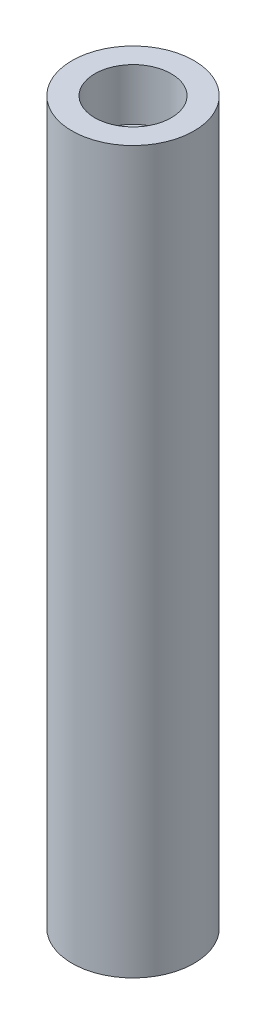
ISO-10303-21;
HEADER;
FILE_DESCRIPTION(('STEP AP214'),'2;1');
FILE_NAME('part.step','',(''),(''),'','','');
FILE_SCHEMA(('AUTOMOTIVE_DESIGN { 1 0 10303 214 1 1 1 1 }'));
ENDSEC;
DATA;
#1=APPLICATION_CONTEXT('core data for automotive mechanical design processes');
#2=APPLICATION_PROTOCOL_DEFINITION('international standard','automotive_design',2000,#1);
#3=PRODUCT_CONTEXT('',#1,'mechanical');
#4=PRODUCT('Part','Part','',(#3));
#5=PRODUCT_RELATED_PRODUCT_CATEGORY('part','',(#4));
#6=PRODUCT_DEFINITION_FORMATION('','',#4);
#7=PRODUCT_DEFINITION_CONTEXT('part definition',#1,'design');
#8=PRODUCT_DEFINITION('design','',#6,#7);
#9=PRODUCT_DEFINITION_SHAPE('','',#8);
#10=(LENGTH_UNIT() NAMED_UNIT(*) SI_UNIT(.MILLI.,.METRE.));
#11=(NAMED_UNIT(*) PLANE_ANGLE_UNIT() SI_UNIT($,.RADIAN.));
#12=(NAMED_UNIT(*) SI_UNIT($,.STERADIAN.) SOLID_ANGLE_UNIT());
#13=UNCERTAINTY_MEASURE_WITH_UNIT(LENGTH_MEASURE(1.E-05),#10,'distance_accuracy_value','');
#14=(GEOMETRIC_REPRESENTATION_CONTEXT(3) GLOBAL_UNCERTAINTY_ASSIGNED_CONTEXT((#13)) GLOBAL_UNIT_ASSIGNED_CONTEXT((#10,
#11,#12)) REPRESENTATION_CONTEXT('',''));
#15=CARTESIAN_POINT('',(0.,0.,0.));
#16=DIRECTION('',(0.,0.,1.));
#17=DIRECTION('',(1.,0.,0.));
#18=AXIS2_PLACEMENT_3D('',#15,#16,#17);
#19=CARTESIAN_POINT('',(0.,58.5,0.));
#20=DIRECTION('',(0.,-1.,0.));
#21=DIRECTION('',(0.,0.,-1.));
#22=AXIS2_PLACEMENT_3D('',#19,#20,#21);
#23=CYLINDRICAL_SURFACE('',#22,4.95);
#24=CARTESIAN_POINT('',(0.,58.5,0.));
#25=DIRECTION('',(0.,1.,0.));
#26=DIRECTION('',(0.,0.,1.));
#27=AXIS2_PLACEMENT_3D('',#24,#25,#26);
#28=CIRCLE('',#27,4.95);
#29=CARTESIAN_POINT('',(0.,58.5,-4.95));
#30=VERTEX_POINT('',#29);
#31=EDGE_CURVE('E10',#30,#30,#28,.T.);
#32=CARTESIAN_POINT('',(0.,0.,0.));
#33=DIRECTION('',(0.,1.,0.));
#34=DIRECTION('',(0.,0.,1.));
#35=AXIS2_PLACEMENT_3D('',#32,#33,#34);
#36=CIRCLE('',#35,4.95);
#37=CARTESIAN_POINT('',(0.,0.,-4.95));
#38=VERTEX_POINT('',#37);
#39=EDGE_CURVE('E40',#38,#38,#36,.T.);
#40=CARTESIAN_POINT('',(0.,58.5,-4.95));
#41=CARTESIAN_POINT('',(0.,57.890625,-4.95));
#42=CARTESIAN_POINT('',(0.,57.28125,-4.95));
#43=CARTESIAN_POINT('',(0.,56.0625,-4.95));
#44=CARTESIAN_POINT('',(0.,55.453125,-4.95));
#45=CARTESIAN_POINT('',(0.,54.234375,-4.95));
#46=CARTESIAN_POINT('',(0.,53.625,-4.95));
#47=CARTESIAN_POINT('',(0.,52.40625,-4.95));
#48=CARTESIAN_POINT('',(0.,51.796875,-4.95));
#49=CARTESIAN_POINT('',(0.,50.578125,-4.95));
#50=CARTESIAN_POINT('',(0.,49.96875,-4.95));
#51=CARTESIAN_POINT('',(0.,48.75,-4.95));
#52=CARTESIAN_POINT('',(0.,48.140625,-4.95));
#53=CARTESIAN_POINT('',(0.,46.921875,-4.95));
#54=CARTESIAN_POINT('',(0.,46.3125,-4.95));
#55=CARTESIAN_POINT('',(0.,45.09375,-4.95));
#56=CARTESIAN_POINT('',(0.,44.484375,-4.95));
#57=CARTESIAN_POINT('',(0.,43.265625,-4.95));
#58=CARTESIAN_POINT('',(0.,42.65625,-4.95));
#59=CARTESIAN_POINT('',(0.,41.4375,-4.95));
#60=CARTESIAN_POINT('',(0.,40.828125,-4.95));
#61=CARTESIAN_POINT('',(0.,39.609375,-4.95));
#62=CARTESIAN_POINT('',(0.,39.,-4.95));
#63=CARTESIAN_POINT('',(0.,37.78125,-4.95));
#64=CARTESIAN_POINT('',(0.,37.171875,-4.95));
#65=CARTESIAN_POINT('',(0.,35.953125,-4.95));
#66=CARTESIAN_POINT('',(0.,35.34375,-4.95));
#67=CARTESIAN_POINT('',(0.,34.125,-4.95));
#68=CARTESIAN_POINT('',(0.,33.515625,-4.95));
#69=CARTESIAN_POINT('',(0.,32.296875,-4.95));
#70=CARTESIAN_POINT('',(0.,31.6875,-4.95));
#71=CARTESIAN_POINT('',(0.,30.46875,-4.95));
#72=CARTESIAN_POINT('',(0.,29.859375,-4.95));
#73=CARTESIAN_POINT('',(0.,28.640625,-4.95));
#74=CARTESIAN_POINT('',(0.,28.03125,-4.95));
#75=CARTESIAN_POINT('',(0.,26.8125,-4.95));
#76=CARTESIAN_POINT('',(0.,26.203125,-4.95));
#77=CARTESIAN_POINT('',(0.,24.984375,-4.95));
#78=CARTESIAN_POINT('',(0.,24.375,-4.95));
#79=CARTESIAN_POINT('',(0.,23.15625,-4.95));
#80=CARTESIAN_POINT('',(0.,22.546875,-4.95));
#81=CARTESIAN_POINT('',(0.,21.328125,-4.95));
#82=CARTESIAN_POINT('',(0.,20.71875,-4.95));
#83=CARTESIAN_POINT('',(0.,19.5,-4.95));
#84=CARTESIAN_POINT('',(0.,18.890625,-4.95));
#85=CARTESIAN_POINT('',(0.,17.671875,-4.95));
#86=CARTESIAN_POINT('',(0.,17.0625,-4.95));
#87=CARTESIAN_POINT('',(0.,15.84375,-4.95));
#88=CARTESIAN_POINT('',(0.,15.234375,-4.95));
#89=CARTESIAN_POINT('',(0.,14.015625,-4.95));
#90=CARTESIAN_POINT('',(0.,13.40625,-4.95));
#91=CARTESIAN_POINT('',(0.,12.1875,-4.95));
#92=CARTESIAN_POINT('',(0.,11.578125,-4.95));
#93=CARTESIAN_POINT('',(0.,10.359375,-4.95));
#94=CARTESIAN_POINT('',(0.,9.74999999999999,-4.95));
#95=CARTESIAN_POINT('',(0.,8.53124999999999,-4.95));
#96=CARTESIAN_POINT('',(0.,7.92187499999999,-4.95));
#97=CARTESIAN_POINT('',(0.,6.70312499999999,-4.95));
#98=CARTESIAN_POINT('',(0.,6.09374999999999,-4.95));
#99=CARTESIAN_POINT('',(0.,4.87499999999999,-4.95));
#100=CARTESIAN_POINT('',(0.,4.26562499999999,-4.95));
#101=CARTESIAN_POINT('',(0.,3.04687499999999,-4.95));
#102=CARTESIAN_POINT('',(0.,2.43749999999999,-4.95));
#103=CARTESIAN_POINT('',(0.,1.21874999999999,-4.95));
#104=CARTESIAN_POINT('',(0.,0.609374999999993,-4.95));
#105=CARTESIAN_POINT('',(0.,0.,-4.95));
#106=B_SPLINE_CURVE_WITH_KNOTS('',3,(#40,#41,#42,#43,#44,#45,#46,#47,#48,#49,#50,#51,#52,#53,
#54,#55,#56,#57,#58,#59,#60,#61,#62,#63,#64,#65,#66,#67,#68,#69,#70,#71,#72,#73,#74,#75,#76,#77,
#78,#79,#80,#81,#82,#83,#84,#85,#86,#87,#88,#89,#90,#91,#92,#93,#94,#95,#96,#97,#98,#99,#100,
#101,#102,#103,#104,#105),.UNSPECIFIED.,.F.,.F.,(4,2,2,2,2,2,2,2,2,2,2,2,2,2,2,2,2,2,2,2,2,2,2,
2,2,2,2,2,2,2,2,2,4),(0.,1.82812500000001,3.65625000000001,5.48437500000001,7.31250000000001,
9.140625,10.96875,12.796875,14.625,16.453125,18.28125,20.109375,21.9375,23.765625,25.59375,
27.421875,29.25,31.078125,32.90625,34.734375,36.5625,38.390625,40.21875,42.046875,43.875,
45.703125,47.53125,49.359375,51.1875,53.015625,54.84375,56.671875,58.5),.UNSPECIFIED.);
#107=EDGE_CURVE('BSEAM37',#30,#38,#106,.T.);
#108=ORIENTED_EDGE('',*,*,#31,.F.);
#109=ORIENTED_EDGE('',*,*,#39,.T.);
#110=ORIENTED_EDGE('',*,*,#107,.T.);
#111=ORIENTED_EDGE('',*,*,#107,.F.);
#112=EDGE_LOOP('',(#108,#110,#109,#111));
#113=FACE_BOUND('',#112,.T.);
#114=ADVANCED_FACE('F37',(#113),#23,.T.);
#115=CARTESIAN_POINT('',(0.,58.5,0.));
#116=DIRECTION('',(0.,1.,0.));
#117=DIRECTION('',(0.,0.,1.));
#118=AXIS2_PLACEMENT_3D('',#115,#116,#117);
#119=PLANE('',#118);
#120=CARTESIAN_POINT('',(0.,58.5,0.));
#121=DIRECTION('',(0.,1.,0.));
#122=DIRECTION('',(0.,0.,1.));
#123=AXIS2_PLACEMENT_3D('',#120,#121,#122);
#124=CIRCLE('',#123,3.1);
#125=CARTESIAN_POINT('',(0.,58.5,3.1));
#126=VERTEX_POINT('',#125);
#127=EDGE_CURVE('E51',#126,#126,#124,.T.);
#128=ORIENTED_EDGE('',*,*,#127,.F.);
#129=EDGE_LOOP('',(#128));
#130=FACE_BOUND('',#129,.T.);
#131=ORIENTED_EDGE('',*,*,#31,.T.);
#132=EDGE_LOOP('',(#131));
#133=FACE_BOUND('',#132,.T.);
#134=ADVANCED_FACE('F68',(#130,#133),#119,.T.);
#135=CARTESIAN_POINT('',(0.,0.,0.));
#136=DIRECTION('',(0.,1.,0.));
#137=DIRECTION('',(0.,0.,1.));
#138=AXIS2_PLACEMENT_3D('',#135,#136,#137);
#139=PLANE('',#138);
#140=ORIENTED_EDGE('',*,*,#39,.F.);
#141=EDGE_LOOP('',(#140));
#142=FACE_BOUND('',#141,.T.);
#143=ADVANCED_FACE('F64',(#142),#139,.F.);
#144=CARTESIAN_POINT('',(0.,54.3,0.));
#145=DIRECTION('',(0.,1.,0.));
#146=DIRECTION('',(0.,0.,1.));
#147=AXIS2_PLACEMENT_3D('',#144,#145,#146);
#148=CYLINDRICAL_SURFACE('',#147,3.1);
#149=CARTESIAN_POINT('',(0.,54.3,0.));
#150=DIRECTION('',(0.,1.,0.));
#151=DIRECTION('',(0.,0.,1.));
#152=AXIS2_PLACEMENT_3D('',#149,#150,#151);
#153=CIRCLE('',#152,3.1);
#154=CARTESIAN_POINT('',(0.,54.3,3.1));
#155=VERTEX_POINT('',#154);
#156=EDGE_CURVE('E49',#155,#155,#153,.T.);
#157=ORIENTED_EDGE('',*,*,#156,.F.);
#158=EDGE_LOOP('',(#157));
#159=FACE_BOUND('',#158,.T.);
#160=ORIENTED_EDGE('',*,*,#127,.T.);
#161=EDGE_LOOP('',(#160));
#162=FACE_BOUND('',#161,.T.);
#163=ADVANCED_FACE('F61',(#159,#162),#148,.F.);
#164=CARTESIAN_POINT('',(0.,54.3,0.));
#165=DIRECTION('',(0.,1.,0.));
#166=DIRECTION('',(0.,0.,1.));
#167=AXIS2_PLACEMENT_3D('',#164,#165,#166);
#168=PLANE('',#167);
#169=ORIENTED_EDGE('',*,*,#156,.T.);
#170=EDGE_LOOP('',(#169));
#171=FACE_BOUND('',#170,.T.);
#172=ADVANCED_FACE('F59',(#171),#168,.T.);
#173=CLOSED_SHELL('',(#114,#134,#143,#163,#172));
#174=MANIFOLD_SOLID_BREP('B2',#173);
#175=ADVANCED_BREP_SHAPE_REPRESENTATION('',(#18,#174),#14);
#176=SHAPE_DEFINITION_REPRESENTATION(#9,#175);
ENDSEC;
END-ISO-10303-21;
